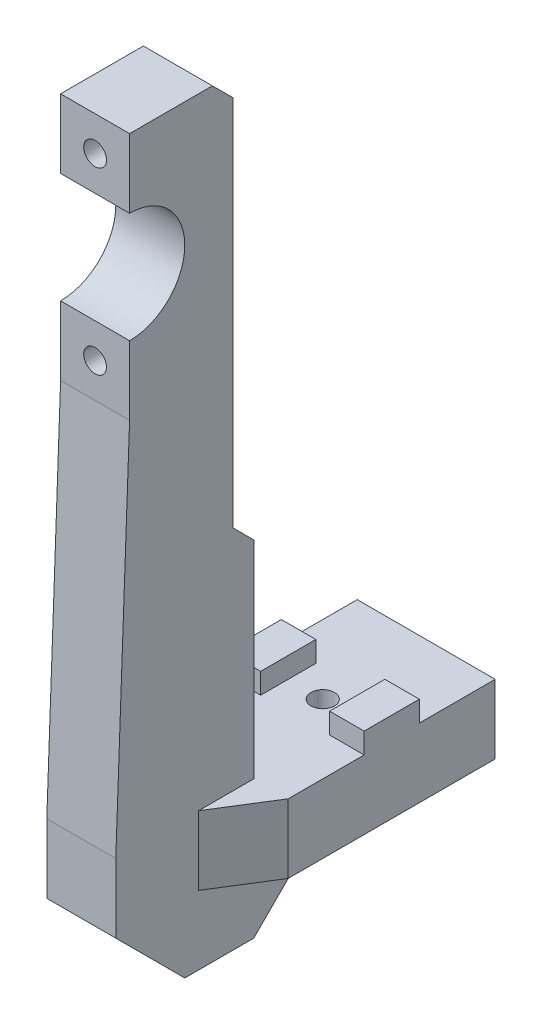
ISO-10303-21;
HEADER;
FILE_DESCRIPTION(('STEP AP214'),'2;1');
FILE_NAME('part.step','',(''),(''),'','','');
FILE_SCHEMA(('AUTOMOTIVE_DESIGN { 1 0 10303 214 1 1 1 1 }'));
ENDSEC;
DATA;
#1=APPLICATION_CONTEXT('core data for automotive mechanical design processes');
#2=APPLICATION_PROTOCOL_DEFINITION('international standard','automotive_design',2000,#1);
#3=PRODUCT_CONTEXT('',#1,'mechanical');
#4=PRODUCT('Part','Part','',(#3));
#5=PRODUCT_RELATED_PRODUCT_CATEGORY('part','',(#4));
#6=PRODUCT_DEFINITION_FORMATION('','',#4);
#7=PRODUCT_DEFINITION_CONTEXT('part definition',#1,'design');
#8=PRODUCT_DEFINITION('design','',#6,#7);
#9=PRODUCT_DEFINITION_SHAPE('','',#8);
#10=(LENGTH_UNIT() NAMED_UNIT(*) SI_UNIT(.MILLI.,.METRE.));
#11=(NAMED_UNIT(*) PLANE_ANGLE_UNIT() SI_UNIT($,.RADIAN.));
#12=(NAMED_UNIT(*) SI_UNIT($,.STERADIAN.) SOLID_ANGLE_UNIT());
#13=UNCERTAINTY_MEASURE_WITH_UNIT(LENGTH_MEASURE(1.E-05),#10,'distance_accuracy_value','');
#14=(GEOMETRIC_REPRESENTATION_CONTEXT(3) GLOBAL_UNCERTAINTY_ASSIGNED_CONTEXT((#13)) GLOBAL_UNIT_ASSIGNED_CONTEXT((#10,
#11,#12)) REPRESENTATION_CONTEXT('',''));
#15=CARTESIAN_POINT('',(0.,0.,0.));
#16=DIRECTION('',(0.,0.,1.));
#17=DIRECTION('',(1.,0.,0.));
#18=AXIS2_PLACEMENT_3D('',#15,#16,#17);
#19=CARTESIAN_POINT('',(0.,0.,0.));
#20=DIRECTION('',(0.,-1.,0.));
#21=DIRECTION('',(0.,0.,-1.));
#22=AXIS2_PLACEMENT_3D('',#19,#20,#21);
#23=PLANE('',#22);
#24=CARTESIAN_POINT('',(10.,0.,-15.));
#25=DIRECTION('',(0.,-1.,0.));
#26=DIRECTION('',(0.,0.,-1.));
#27=AXIS2_PLACEMENT_3D('',#24,#25,#26);
#28=CIRCLE('',#27,1.7);
#29=CARTESIAN_POINT('',(10.,0.,-16.7));
#30=VERTEX_POINT('',#29);
#31=EDGE_CURVE('E247',#30,#30,#28,.T.);
#32=ORIENTED_EDGE('',*,*,#31,.T.);
#33=EDGE_LOOP('',(#32));
#34=FACE_BOUND('',#33,.T.);
#35=DIRECTION('',(-1.,0.,0.));
#36=VECTOR('',#35,1.);
#37=CARTESIAN_POINT('',(20.,0.,-19.));
#38=LINE('',#37,#36);
#39=CARTESIAN_POINT('',(20.,0.,-19.));
#40=VERTEX_POINT('',#39);
#41=CARTESIAN_POINT('',(15.,0.,-19.));
#42=VERTEX_POINT('',#41);
#43=EDGE_CURVE('E256',#40,#42,#38,.T.);
#44=ORIENTED_EDGE('',*,*,#43,.F.);
#45=DIRECTION('',(0.,0.,-1.));
#46=VECTOR('',#45,1.);
#47=CARTESIAN_POINT('',(20.,0.,0.));
#48=LINE('',#47,#46);
#49=CARTESIAN_POINT('',(20.,0.,-30.));
#50=VERTEX_POINT('',#49);
#51=EDGE_CURVE('E440',#40,#50,#48,.T.);
#52=ORIENTED_EDGE('',*,*,#51,.T.);
#53=DIRECTION('',(-1.,0.,0.));
#54=VECTOR('',#53,1.);
#55=CARTESIAN_POINT('',(0.,0.,-30.));
#56=LINE('',#55,#54);
#57=CARTESIAN_POINT('',(0.,0.,-30.));
#58=VERTEX_POINT('',#57);
#59=EDGE_CURVE('E406',#50,#58,#56,.T.);
#60=ORIENTED_EDGE('',*,*,#59,.T.);
#61=DIRECTION('',(0.,0.,1.));
#62=VECTOR('',#61,1.);
#63=CARTESIAN_POINT('',(0.,0.,0.));
#64=LINE('',#63,#62);
#65=CARTESIAN_POINT('',(0.,0.,-19.));
#66=VERTEX_POINT('',#65);
#67=EDGE_CURVE('E423',#58,#66,#64,.T.);
#68=ORIENTED_EDGE('',*,*,#67,.T.);
#69=DIRECTION('',(-1.,0.,0.));
#70=VECTOR('',#69,1.);
#71=CARTESIAN_POINT('',(0.,0.,-19.));
#72=LINE('',#71,#70);
#73=CARTESIAN_POINT('',(5.,0.,-19.));
#74=VERTEX_POINT('',#73);
#75=EDGE_CURVE('E291',#74,#66,#72,.T.);
#76=ORIENTED_EDGE('',*,*,#75,.F.);
#77=DIRECTION('',(0.,0.,-1.));
#78=VECTOR('',#77,1.);
#79=CARTESIAN_POINT('',(5.,0.,-19.));
#80=LINE('',#79,#78);
#81=CARTESIAN_POINT('',(5.,0.,-11.));
#82=VERTEX_POINT('',#81);
#83=EDGE_CURVE('E300',#82,#74,#80,.T.);
#84=ORIENTED_EDGE('',*,*,#83,.F.);
#85=DIRECTION('',(1.,0.,0.));
#86=VECTOR('',#85,1.);
#87=CARTESIAN_POINT('',(0.,0.,-11.));
#88=LINE('',#87,#86);
#89=CARTESIAN_POINT('',(0.,0.,-11.));
#90=VERTEX_POINT('',#89);
#91=EDGE_CURVE('E286',#90,#82,#88,.T.);
#92=ORIENTED_EDGE('',*,*,#91,.F.);
#93=CARTESIAN_POINT('',(0.,0.,0.));
#94=VERTEX_POINT('',#93);
#95=EDGE_CURVE('E401',#90,#94,#64,.T.);
#96=ORIENTED_EDGE('',*,*,#95,.T.);
#97=DIRECTION('',(0.52999894000318,0.,0.847998304005088));
#98=VECTOR('',#97,1.);
#99=CARTESIAN_POINT('',(0.,0.,0.));
#100=LINE('',#99,#98);
#101=CARTESIAN_POINT('',(5.,0.,8.));
#102=VERTEX_POINT('',#101);
#103=EDGE_CURVE('E425',#94,#102,#100,.T.);
#104=ORIENTED_EDGE('',*,*,#103,.T.);
#105=DIRECTION('',(0.,0.,-1.));
#106=VECTOR('',#105,1.);
#107=CARTESIAN_POINT('',(5.,0.,8.));
#108=LINE('',#107,#106);
#109=CARTESIAN_POINT('',(5.,0.,0.));
#110=VERTEX_POINT('',#109);
#111=EDGE_CURVE('E428',#102,#110,#108,.T.);
#112=ORIENTED_EDGE('',*,*,#111,.T.);
#113=DIRECTION('',(1.,0.,0.));
#114=VECTOR('',#113,1.);
#115=CARTESIAN_POINT('',(5.,0.,0.));
#116=LINE('',#115,#114);
#117=CARTESIAN_POINT('',(15.,0.,0.));
#118=VERTEX_POINT('',#117);
#119=EDGE_CURVE('E431',#110,#118,#116,.T.);
#120=ORIENTED_EDGE('',*,*,#119,.T.);
#121=DIRECTION('',(0.,0.,1.));
#122=VECTOR('',#121,1.);
#123=CARTESIAN_POINT('',(15.,0.,8.));
#124=LINE('',#123,#122);
#125=CARTESIAN_POINT('',(15.,0.,8.));
#126=VERTEX_POINT('',#125);
#127=EDGE_CURVE('E434',#118,#126,#124,.T.);
#128=ORIENTED_EDGE('',*,*,#127,.T.);
#129=DIRECTION('',(0.52999894000318,0.,-0.847998304005088));
#130=VECTOR('',#129,1.);
#131=CARTESIAN_POINT('',(20.,0.,0.));
#132=LINE('',#131,#130);
#133=CARTESIAN_POINT('',(20.,0.,0.));
#134=VERTEX_POINT('',#133);
#135=EDGE_CURVE('E437',#126,#134,#132,.T.);
#136=ORIENTED_EDGE('',*,*,#135,.T.);
#137=CARTESIAN_POINT('',(20.,0.,-11.));
#138=VERTEX_POINT('',#137);
#139=EDGE_CURVE('E441',#134,#138,#48,.T.);
#140=ORIENTED_EDGE('',*,*,#139,.T.);
#141=DIRECTION('',(1.,0.,0.));
#142=VECTOR('',#141,1.);
#143=CARTESIAN_POINT('',(20.,0.,-11.));
#144=LINE('',#143,#142);
#145=CARTESIAN_POINT('',(15.,0.,-11.));
#146=VERTEX_POINT('',#145);
#147=EDGE_CURVE('E261',#146,#138,#144,.T.);
#148=ORIENTED_EDGE('',*,*,#147,.F.);
#149=DIRECTION('',(0.,0.,1.));
#150=VECTOR('',#149,1.);
#151=CARTESIAN_POINT('',(15.,0.,-19.));
#152=LINE('',#151,#150);
#153=EDGE_CURVE('E270',#42,#146,#152,.T.);
#154=ORIENTED_EDGE('',*,*,#153,.F.);
#155=EDGE_LOOP('',(#44,#52,#60,#68,#76,#84,#92,#96,#104,#112,#120,#128,#136,#140,#148,#154));
#156=FACE_BOUND('',#155,.T.);
#157=ADVANCED_FACE('F37',(#34,#156),#23,.F.);
#158=CARTESIAN_POINT('',(0.,-10.,0.));
#159=DIRECTION('',(-1.,0.,0.));
#160=DIRECTION('',(0.,0.,1.));
#161=AXIS2_PLACEMENT_3D('',#158,#159,#160);
#162=PLANE('',#161);
#163=ORIENTED_EDGE('',*,*,#67,.F.);
#164=DIRECTION('',(0.,1.,0.));
#165=VECTOR('',#164,1.);
#166=CARTESIAN_POINT('',(0.,-10.,-30.));
#167=LINE('',#166,#165);
#168=CARTESIAN_POINT('',(0.,-10.,-30.));
#169=VERTEX_POINT('',#168);
#170=EDGE_CURVE('E445',#169,#58,#167,.T.);
#171=ORIENTED_EDGE('',*,*,#170,.F.);
#172=DIRECTION('',(0.,0.,1.));
#173=VECTOR('',#172,1.);
#174=CARTESIAN_POINT('',(0.,-10.,0.));
#175=LINE('',#174,#173);
#176=CARTESIAN_POINT('',(0.,-10.,0.));
#177=VERTEX_POINT('',#176);
#178=EDGE_CURVE('E402',#169,#177,#175,.T.);
#179=ORIENTED_EDGE('',*,*,#178,.T.);
#180=DIRECTION('',(0.,1.,0.));
#181=VECTOR('',#180,1.);
#182=CARTESIAN_POINT('',(0.,-10.,0.));
#183=LINE('',#182,#181);
#184=EDGE_CURVE('E422',#177,#94,#183,.T.);
#185=ORIENTED_EDGE('',*,*,#184,.T.);
#186=ORIENTED_EDGE('',*,*,#95,.F.);
#187=DIRECTION('',(0.,-1.,0.));
#188=VECTOR('',#187,1.);
#189=CARTESIAN_POINT('',(0.,3.,-11.));
#190=LINE('',#189,#188);
#191=CARTESIAN_POINT('',(0.,3.,-11.));
#192=VERTEX_POINT('',#191);
#193=EDGE_CURVE('E313',#192,#90,#190,.T.);
#194=ORIENTED_EDGE('',*,*,#193,.F.);
#195=DIRECTION('',(0.,0.,1.));
#196=VECTOR('',#195,1.);
#197=CARTESIAN_POINT('',(0.,3.,-19.));
#198=LINE('',#197,#196);
#199=CARTESIAN_POINT('',(0.,3.,-19.));
#200=VERTEX_POINT('',#199);
#201=EDGE_CURVE('E287',#200,#192,#198,.T.);
#202=ORIENTED_EDGE('',*,*,#201,.F.);
#203=DIRECTION('',(0.,-1.,0.));
#204=VECTOR('',#203,1.);
#205=CARTESIAN_POINT('',(0.,3.,-19.));
#206=LINE('',#205,#204);
#207=EDGE_CURVE('E297',#200,#66,#206,.T.);
#208=ORIENTED_EDGE('',*,*,#207,.T.);
#209=EDGE_LOOP('',(#163,#171,#179,#185,#186,#194,#202,#208));
#210=FACE_BOUND('',#209,.T.);
#211=ADVANCED_FACE('F489',(#210),#162,.T.);
#212=CARTESIAN_POINT('',(0.,-10.,-30.));
#213=DIRECTION('',(0.,0.,-1.));
#214=DIRECTION('',(-1.,0.,0.));
#215=AXIS2_PLACEMENT_3D('',#212,#213,#214);
#216=PLANE('',#215);
#217=ORIENTED_EDGE('',*,*,#59,.F.);
#218=DIRECTION('',(0.,1.,0.));
#219=VECTOR('',#218,1.);
#220=CARTESIAN_POINT('',(20.,-10.,-30.));
#221=LINE('',#220,#219);
#222=CARTESIAN_POINT('',(20.,-10.,-30.));
#223=VERTEX_POINT('',#222);
#224=EDGE_CURVE('E448',#223,#50,#221,.T.);
#225=ORIENTED_EDGE('',*,*,#224,.F.);
#226=DIRECTION('',(-1.,0.,0.));
#227=VECTOR('',#226,1.);
#228=CARTESIAN_POINT('',(0.,-10.,-30.));
#229=LINE('',#228,#227);
#230=EDGE_CURVE('E419',#223,#169,#229,.T.);
#231=ORIENTED_EDGE('',*,*,#230,.T.);
#232=ORIENTED_EDGE('',*,*,#170,.T.);
#233=EDGE_LOOP('',(#217,#225,#231,#232));
#234=FACE_BOUND('',#233,.T.);
#235=ADVANCED_FACE('F495',(#234),#216,.T.);
#236=CARTESIAN_POINT('',(20.,-10.,0.));
#237=DIRECTION('',(1.,0.,0.));
#238=DIRECTION('',(0.,0.,-1.));
#239=AXIS2_PLACEMENT_3D('',#236,#237,#238);
#240=PLANE('',#239);
#241=ORIENTED_EDGE('',*,*,#139,.F.);
#242=DIRECTION('',(0.,1.,0.));
#243=VECTOR('',#242,1.);
#244=CARTESIAN_POINT('',(20.,-10.,0.));
#245=LINE('',#244,#243);
#246=CARTESIAN_POINT('',(20.,-10.,0.));
#247=VERTEX_POINT('',#246);
#248=EDGE_CURVE('E451',#247,#134,#245,.T.);
#249=ORIENTED_EDGE('',*,*,#248,.F.);
#250=DIRECTION('',(0.,0.,-1.));
#251=VECTOR('',#250,1.);
#252=CARTESIAN_POINT('',(20.,-10.,0.));
#253=LINE('',#252,#251);
#254=EDGE_CURVE('E416',#247,#223,#253,.T.);
#255=ORIENTED_EDGE('',*,*,#254,.T.);
#256=ORIENTED_EDGE('',*,*,#224,.T.);
#257=ORIENTED_EDGE('',*,*,#51,.F.);
#258=DIRECTION('',(0.,-1.,0.));
#259=VECTOR('',#258,1.);
#260=CARTESIAN_POINT('',(20.,3.,-19.));
#261=LINE('',#260,#259);
#262=CARTESIAN_POINT('',(20.,3.,-19.));
#263=VERTEX_POINT('',#262);
#264=EDGE_CURVE('E283',#263,#40,#261,.T.);
#265=ORIENTED_EDGE('',*,*,#264,.F.);
#266=DIRECTION('',(0.,0.,-1.));
#267=VECTOR('',#266,1.);
#268=CARTESIAN_POINT('',(20.,3.,-19.));
#269=LINE('',#268,#267);
#270=CARTESIAN_POINT('',(20.,3.,-11.));
#271=VERTEX_POINT('',#270);
#272=EDGE_CURVE('E257',#271,#263,#269,.T.);
#273=ORIENTED_EDGE('',*,*,#272,.F.);
#274=DIRECTION('',(0.,-1.,0.));
#275=VECTOR('',#274,1.);
#276=CARTESIAN_POINT('',(20.,3.,-11.));
#277=LINE('',#276,#275);
#278=EDGE_CURVE('E267',#271,#138,#277,.T.);
#279=ORIENTED_EDGE('',*,*,#278,.T.);
#280=EDGE_LOOP('',(#241,#249,#255,#256,#257,#265,#273,#279));
#281=FACE_BOUND('',#280,.T.);
#282=ADVANCED_FACE('F504',(#281),#240,.T.);
#283=CARTESIAN_POINT('',(20.,-10.,0.));
#284=DIRECTION('',(0.847998304005088,0.,0.52999894000318));
#285=DIRECTION('',(0.52999894000318,0.,-0.847998304005088));
#286=AXIS2_PLACEMENT_3D('',#283,#284,#285);
#287=PLANE('',#286);
#288=ORIENTED_EDGE('',*,*,#135,.F.);
#289=DIRECTION('',(0.,1.,0.));
#290=VECTOR('',#289,1.);
#291=CARTESIAN_POINT('',(15.,-10.,8.));
#292=LINE('',#291,#290);
#293=CARTESIAN_POINT('',(15.,-10.,8.));
#294=VERTEX_POINT('',#293);
#295=EDGE_CURVE('E453',#294,#126,#292,.T.);
#296=ORIENTED_EDGE('',*,*,#295,.F.);
#297=DIRECTION('',(0.52999894000318,0.,-0.847998304005088));
#298=VECTOR('',#297,1.);
#299=CARTESIAN_POINT('',(20.,-10.,0.));
#300=LINE('',#299,#298);
#301=EDGE_CURVE('E413',#294,#247,#300,.T.);
#302=ORIENTED_EDGE('',*,*,#301,.T.);
#303=ORIENTED_EDGE('',*,*,#248,.T.);
#304=EDGE_LOOP('',(#288,#296,#302,#303));
#305=FACE_BOUND('',#304,.T.);
#306=ADVANCED_FACE('F508',(#305),#287,.T.);
#307=CARTESIAN_POINT('',(0.,-10.,0.));
#308=DIRECTION('',(-0.847998304005088,0.,0.52999894000318));
#309=DIRECTION('',(0.52999894000318,0.,0.847998304005088));
#310=AXIS2_PLACEMENT_3D('',#307,#308,#309);
#311=PLANE('',#310);
#312=ORIENTED_EDGE('',*,*,#103,.F.);
#313=ORIENTED_EDGE('',*,*,#184,.F.);
#314=DIRECTION('',(0.52999894000318,0.,0.847998304005088));
#315=VECTOR('',#314,1.);
#316=CARTESIAN_POINT('',(0.,-10.,0.));
#317=LINE('',#316,#315);
#318=CARTESIAN_POINT('',(5.,-10.,8.));
#319=VERTEX_POINT('',#318);
#320=EDGE_CURVE('E405',#177,#319,#317,.T.);
#321=ORIENTED_EDGE('',*,*,#320,.T.);
#322=DIRECTION('',(0.,1.,0.));
#323=VECTOR('',#322,1.);
#324=CARTESIAN_POINT('',(5.,-10.,8.));
#325=LINE('',#324,#323);
#326=EDGE_CURVE('E455',#319,#102,#325,.T.);
#327=ORIENTED_EDGE('',*,*,#326,.T.);
#328=EDGE_LOOP('',(#312,#313,#321,#327));
#329=FACE_BOUND('',#328,.T.);
#330=ADVANCED_FACE('F512',(#329),#311,.T.);
#331=CARTESIAN_POINT('',(0.,-10.,0.));
#332=DIRECTION('',(0.,-1.,0.));
#333=DIRECTION('',(0.,0.,-1.));
#334=AXIS2_PLACEMENT_3D('',#331,#332,#333);
#335=PLANE('',#334);
#336=CARTESIAN_POINT('',(10.,-10.,-15.));
#337=DIRECTION('',(0.,-1.,0.));
#338=DIRECTION('',(0.,0.,-1.));
#339=AXIS2_PLACEMENT_3D('',#336,#337,#338);
#340=CIRCLE('',#339,3.15);
#341=CARTESIAN_POINT('',(10.,-10.,-18.15));
#342=VERTEX_POINT('',#341);
#343=EDGE_CURVE('E253',#342,#342,#340,.T.);
#344=ORIENTED_EDGE('',*,*,#343,.F.);
#345=EDGE_LOOP('',(#344));
#346=FACE_BOUND('',#345,.T.);
#347=DIRECTION('',(0.,0.,1.));
#348=VECTOR('',#347,1.);
#349=CARTESIAN_POINT('',(15.,-10.,8.));
#350=LINE('',#349,#348);
#351=CARTESIAN_POINT('',(15.,-10.,-10.));
#352=VERTEX_POINT('',#351);
#353=EDGE_CURVE('E411',#352,#294,#350,.T.);
#354=ORIENTED_EDGE('',*,*,#353,.F.);
#355=DIRECTION('',(-1.,0.,0.));
#356=VECTOR('',#355,1.);
#357=CARTESIAN_POINT('',(15.,-10.,-10.));
#358=LINE('',#357,#356);
#359=CARTESIAN_POINT('',(5.,-10.,-10.));
#360=VERTEX_POINT('',#359);
#361=EDGE_CURVE('E392',#352,#360,#358,.T.);
#362=ORIENTED_EDGE('',*,*,#361,.T.);
#363=DIRECTION('',(0.,0.,-1.));
#364=VECTOR('',#363,1.);
#365=CARTESIAN_POINT('',(5.,-10.,8.));
#366=LINE('',#365,#364);
#367=EDGE_CURVE('E409',#319,#360,#366,.T.);
#368=ORIENTED_EDGE('',*,*,#367,.F.);
#369=ORIENTED_EDGE('',*,*,#320,.F.);
#370=ORIENTED_EDGE('',*,*,#178,.F.);
#371=ORIENTED_EDGE('',*,*,#230,.F.);
#372=ORIENTED_EDGE('',*,*,#254,.F.);
#373=ORIENTED_EDGE('',*,*,#301,.F.);
#374=EDGE_LOOP('',(#354,#362,#368,#369,#370,#371,#372,#373));
#375=FACE_BOUND('',#374,.T.);
#376=ADVANCED_FACE('F500',(#346,#375),#335,.T.);
#377=CARTESIAN_POINT('',(15.,30.,0.));
#378=DIRECTION('',(0.,0.,1.));
#379=DIRECTION('',(0.,-1.,0.));
#380=AXIS2_PLACEMENT_3D('',#377,#378,#379);
#381=PLANE('',#380);
#382=DIRECTION('',(0.,1.,0.));
#383=VECTOR('',#382,1.);
#384=CARTESIAN_POINT('',(15.,30.,0.));
#385=LINE('',#384,#383);
#386=CARTESIAN_POINT('',(15.,30.,0.));
#387=VERTEX_POINT('',#386);
#388=EDGE_CURVE('E326',#118,#387,#385,.T.);
#389=ORIENTED_EDGE('',*,*,#388,.F.);
#390=ORIENTED_EDGE('',*,*,#119,.F.);
#391=DIRECTION('',(0.,1.,0.));
#392=VECTOR('',#391,1.);
#393=CARTESIAN_POINT('',(5.,30.,0.));
#394=LINE('',#393,#392);
#395=CARTESIAN_POINT('',(5.,30.,0.));
#396=VERTEX_POINT('',#395);
#397=EDGE_CURVE('E352',#110,#396,#394,.T.);
#398=ORIENTED_EDGE('',*,*,#397,.T.);
#399=DIRECTION('',(-1.,0.,0.));
#400=VECTOR('',#399,1.);
#401=CARTESIAN_POINT('',(15.,30.,0.));
#402=LINE('',#401,#400);
#403=EDGE_CURVE('E389',#387,#396,#402,.T.);
#404=ORIENTED_EDGE('',*,*,#403,.F.);
#405=EDGE_LOOP('',(#389,#390,#398,#404));
#406=FACE_BOUND('',#405,.T.);
#407=ADVANCED_FACE('F519',(#406),#381,.F.);
#408=CARTESIAN_POINT('',(15.,-9.99999999999999,20.));
#409=DIRECTION('',(0.,0.707106781186548,-0.707106781186547));
#410=DIRECTION('',(0.,0.707106781186547,0.707106781186548));
#411=AXIS2_PLACEMENT_3D('',#408,#409,#410);
#412=PLANE('',#411);
#413=DIRECTION('',(0.,-0.707106781186547,-0.707106781186548));
#414=VECTOR('',#413,1.);
#415=CARTESIAN_POINT('',(5.,-9.99999999999999,20.));
#416=LINE('',#415,#414);
#417=CARTESIAN_POINT('',(5.,-9.99999999999999,20.));
#418=VERTEX_POINT('',#417);
#419=CARTESIAN_POINT('',(5.,-20.,9.99999999999999));
#420=VERTEX_POINT('',#419);
#421=EDGE_CURVE('E316',#418,#420,#416,.T.);
#422=ORIENTED_EDGE('',*,*,#421,.T.);
#423=DIRECTION('',(-1.,0.,0.));
#424=VECTOR('',#423,1.);
#425=CARTESIAN_POINT('',(15.,-20.,9.99999999999999));
#426=LINE('',#425,#424);
#427=CARTESIAN_POINT('',(15.,-20.,9.99999999999999));
#428=VERTEX_POINT('',#427);
#429=EDGE_CURVE('E398',#428,#420,#426,.T.);
#430=ORIENTED_EDGE('',*,*,#429,.F.);
#431=DIRECTION('',(0.,-0.707106781186547,-0.707106781186548));
#432=VECTOR('',#431,1.);
#433=CARTESIAN_POINT('',(15.,-9.99999999999999,20.));
#434=LINE('',#433,#432);
#435=CARTESIAN_POINT('',(15.,-9.99999999999999,20.));
#436=VERTEX_POINT('',#435);
#437=EDGE_CURVE('E317',#436,#428,#434,.T.);
#438=ORIENTED_EDGE('',*,*,#437,.F.);
#439=DIRECTION('',(-1.,0.,0.));
#440=VECTOR('',#439,1.);
#441=CARTESIAN_POINT('',(15.,-9.99999999999999,20.));
#442=LINE('',#441,#440);
#443=EDGE_CURVE('E344',#436,#418,#442,.T.);
#444=ORIENTED_EDGE('',*,*,#443,.T.);
#445=EDGE_LOOP('',(#422,#430,#438,#444));
#446=FACE_BOUND('',#445,.T.);
#447=ADVANCED_FACE('F620',(#446),#412,.F.);
#448=CARTESIAN_POINT('',(15.,-20.,9.99999999999999));
#449=DIRECTION('',(0.,1.,0.));
#450=DIRECTION('',(0.,0.,1.));
#451=AXIS2_PLACEMENT_3D('',#448,#449,#450);
#452=PLANE('',#451);
#453=DIRECTION('',(0.,0.,-1.));
#454=VECTOR('',#453,1.);
#455=CARTESIAN_POINT('',(5.,-20.,9.99999999999999));
#456=LINE('',#455,#454);
#457=CARTESIAN_POINT('',(5.,-20.,0.));
#458=VERTEX_POINT('',#457);
#459=EDGE_CURVE('E347',#420,#458,#456,.T.);
#460=ORIENTED_EDGE('',*,*,#459,.T.);
#461=DIRECTION('',(-1.,0.,0.));
#462=VECTOR('',#461,1.);
#463=CARTESIAN_POINT('',(15.,-20.,0.));
#464=LINE('',#463,#462);
#465=CARTESIAN_POINT('',(15.,-20.,0.));
#466=VERTEX_POINT('',#465);
#467=EDGE_CURVE('E395',#466,#458,#464,.T.);
#468=ORIENTED_EDGE('',*,*,#467,.F.);
#469=DIRECTION('',(0.,0.,-1.));
#470=VECTOR('',#469,1.);
#471=CARTESIAN_POINT('',(15.,-20.,9.99999999999999));
#472=LINE('',#471,#470);
#473=EDGE_CURVE('E320',#428,#466,#472,.T.);
#474=ORIENTED_EDGE('',*,*,#473,.F.);
#475=ORIENTED_EDGE('',*,*,#429,.T.);
#476=EDGE_LOOP('',(#460,#468,#474,#475));
#477=FACE_BOUND('',#476,.T.);
#478=ADVANCED_FACE('F623',(#477),#452,.F.);
#479=CARTESIAN_POINT('',(15.,-10.,-10.));
#480=DIRECTION('',(0.,0.707106781186547,0.707106781186548));
#481=DIRECTION('',(0.,-0.707106781186548,0.707106781186547));
#482=AXIS2_PLACEMENT_3D('',#479,#480,#481);
#483=PLANE('',#482);
#484=DIRECTION('',(0.,0.707106781186548,-0.707106781186547));
#485=VECTOR('',#484,1.);
#486=CARTESIAN_POINT('',(5.,-10.,-10.));
#487=LINE('',#486,#485);
#488=EDGE_CURVE('E349',#458,#360,#487,.T.);
#489=ORIENTED_EDGE('',*,*,#488,.T.);
#490=ORIENTED_EDGE('',*,*,#361,.F.);
#491=DIRECTION('',(0.,0.707106781186548,-0.707106781186547));
#492=VECTOR('',#491,1.);
#493=CARTESIAN_POINT('',(15.,-10.,-10.));
#494=LINE('',#493,#492);
#495=EDGE_CURVE('E323',#466,#352,#494,.T.);
#496=ORIENTED_EDGE('',*,*,#495,.F.);
#497=ORIENTED_EDGE('',*,*,#467,.T.);
#498=EDGE_LOOP('',(#489,#490,#496,#497));
#499=FACE_BOUND('',#498,.T.);
#500=ADVANCED_FACE('F541',(#499),#483,.F.);
#501=CARTESIAN_POINT('',(15.,30.,0.));
#502=DIRECTION('',(0.,-0.707106781186547,0.707106781186548));
#503=DIRECTION('',(0.,-0.707106781186548,-0.707106781186547));
#504=AXIS2_PLACEMENT_3D('',#501,#502,#503);
#505=PLANE('',#504);
#506=DIRECTION('',(0.,0.707106781186548,0.707106781186547));
#507=VECTOR('',#506,1.);
#508=CARTESIAN_POINT('',(5.,30.,0.));
#509=LINE('',#508,#507);
#510=CARTESIAN_POINT('',(5.,33.,2.99999999999999));
#511=VERTEX_POINT('',#510);
#512=EDGE_CURVE('E354',#396,#511,#509,.T.);
#513=ORIENTED_EDGE('',*,*,#512,.T.);
#514=DIRECTION('',(-1.,0.,0.));
#515=VECTOR('',#514,1.);
#516=CARTESIAN_POINT('',(15.,33.,2.99999999999999));
#517=LINE('',#516,#515);
#518=CARTESIAN_POINT('',(15.,33.,2.99999999999999));
#519=VERTEX_POINT('',#518);
#520=EDGE_CURVE('E386',#519,#511,#517,.T.);
#521=ORIENTED_EDGE('',*,*,#520,.F.);
#522=DIRECTION('',(0.,0.707106781186548,0.707106781186547));
#523=VECTOR('',#522,1.);
#524=CARTESIAN_POINT('',(15.,30.,0.));
#525=LINE('',#524,#523);
#526=EDGE_CURVE('E328',#387,#519,#525,.T.);
#527=ORIENTED_EDGE('',*,*,#526,.F.);
#528=ORIENTED_EDGE('',*,*,#403,.T.);
#529=EDGE_LOOP('',(#513,#521,#527,#528));
#530=FACE_BOUND('',#529,.T.);
#531=ADVANCED_FACE('F614',(#530),#505,.F.);
#532=CARTESIAN_POINT('',(15.,33.,2.99999999999999));
#533=DIRECTION('',(0.,0.,1.));
#534=DIRECTION('',(0.,-1.,0.));
#535=AXIS2_PLACEMENT_3D('',#532,#533,#534);
#536=PLANE('',#535);
#537=DIRECTION('',(0.,1.,0.));
#538=VECTOR('',#537,1.);
#539=CARTESIAN_POINT('',(5.,33.,2.99999999999999));
#540=LINE('',#539,#538);
#541=CARTESIAN_POINT('',(5.,87.,2.99999999999999));
#542=VERTEX_POINT('',#541);
#543=EDGE_CURVE('E356',#511,#542,#540,.T.);
#544=ORIENTED_EDGE('',*,*,#543,.T.);
#545=DIRECTION('',(1.,0.,0.));
#546=VECTOR('',#545,1.);
#547=CARTESIAN_POINT('',(15.,87.,2.99999999999999));
#548=LINE('',#547,#546);
#549=CARTESIAN_POINT('',(15.,87.,2.99999999999999));
#550=VERTEX_POINT('',#549);
#551=EDGE_CURVE('E46',#542,#550,#548,.T.);
#552=ORIENTED_EDGE('',*,*,#551,.T.);
#553=DIRECTION('',(0.,1.,0.));
#554=VECTOR('',#553,1.);
#555=CARTESIAN_POINT('',(15.,33.,2.99999999999999));
#556=LINE('',#555,#554);
#557=EDGE_CURVE('E330',#519,#550,#556,.T.);
#558=ORIENTED_EDGE('',*,*,#557,.F.);
#559=ORIENTED_EDGE('',*,*,#520,.T.);
#560=EDGE_LOOP('',(#544,#552,#558,#559));
#561=FACE_BOUND('',#560,.T.);
#562=ADVANCED_FACE('F611',(#561),#536,.F.);
#563=CARTESIAN_POINT('',(15.,90.,2.99999999999999));
#564=DIRECTION('',(0.,-1.,0.));
#565=DIRECTION('',(0.,0.,-1.));
#566=AXIS2_PLACEMENT_3D('',#563,#564,#565);
#567=PLANE('',#566);
#568=DIRECTION('',(0.,0.,1.));
#569=VECTOR('',#568,1.);
#570=CARTESIAN_POINT('',(15.,90.,2.99999999999999));
#571=LINE('',#570,#569);
#572=CARTESIAN_POINT('',(15.,90.,6.));
#573=VERTEX_POINT('',#572);
#574=CARTESIAN_POINT('',(15.,90.,18.));
#575=VERTEX_POINT('',#574);
#576=EDGE_CURVE('E332',#573,#575,#571,.T.);
#577=ORIENTED_EDGE('',*,*,#576,.F.);
#578=DIRECTION('',(-1.,0.,0.));
#579=VECTOR('',#578,1.);
#580=CARTESIAN_POINT('',(15.,90.,6.));
#581=LINE('',#580,#579);
#582=CARTESIAN_POINT('',(5.,90.,6.));
#583=VERTEX_POINT('',#582);
#584=EDGE_CURVE('E447',#573,#583,#581,.T.);
#585=ORIENTED_EDGE('',*,*,#584,.T.);
#586=DIRECTION('',(0.,0.,1.));
#587=VECTOR('',#586,1.);
#588=CARTESIAN_POINT('',(5.,90.,2.99999999999999));
#589=LINE('',#588,#587);
#590=CARTESIAN_POINT('',(5.,90.,18.));
#591=VERTEX_POINT('',#590);
#592=EDGE_CURVE('E358',#583,#591,#589,.T.);
#593=ORIENTED_EDGE('',*,*,#592,.T.);
#594=DIRECTION('',(-1.,0.,0.));
#595=VECTOR('',#594,1.);
#596=CARTESIAN_POINT('',(15.,90.,18.));
#597=LINE('',#596,#595);
#598=EDGE_CURVE('E383',#575,#591,#597,.T.);
#599=ORIENTED_EDGE('',*,*,#598,.F.);
#600=EDGE_LOOP('',(#577,#585,#593,#599));
#601=FACE_BOUND('',#600,.T.);
#602=ADVANCED_FACE('F465',(#601),#567,.F.);
#603=CARTESIAN_POINT('',(15.,90.,18.));
#604=DIRECTION('',(0.,0.,-1.));
#605=DIRECTION('',(-1.,0.,0.));
#606=AXIS2_PLACEMENT_3D('',#603,#604,#605);
#607=PLANE('',#606);
#608=CARTESIAN_POINT('',(10.,85.,18.));
#609=DIRECTION('',(0.,0.,1.));
#610=DIRECTION('',(0.,-1.,0.));
#611=AXIS2_PLACEMENT_3D('',#608,#609,#610);
#612=CIRCLE('',#611,1.65);
#613=CARTESIAN_POINT('',(10.,83.35,18.));
#614=VERTEX_POINT('',#613);
#615=EDGE_CURVE('E236',#614,#614,#612,.T.);
#616=ORIENTED_EDGE('',*,*,#615,.F.);
#617=EDGE_LOOP('',(#616));
#618=FACE_BOUND('',#617,.T.);
#619=DIRECTION('',(0.,-1.,0.));
#620=VECTOR('',#619,1.);
#621=CARTESIAN_POINT('',(5.,90.,18.));
#622=LINE('',#621,#620);
#623=CARTESIAN_POINT('',(5.,80.,18.));
#624=VERTEX_POINT('',#623);
#625=EDGE_CURVE('E360',#591,#624,#622,.T.);
#626=ORIENTED_EDGE('',*,*,#625,.T.);
#627=DIRECTION('',(-1.,0.,0.));
#628=VECTOR('',#627,1.);
#629=CARTESIAN_POINT('',(15.,80.,18.));
#630=LINE('',#629,#628);
#631=CARTESIAN_POINT('',(15.,80.,18.));
#632=VERTEX_POINT('',#631);
#633=EDGE_CURVE('E380',#632,#624,#630,.T.);
#634=ORIENTED_EDGE('',*,*,#633,.F.);
#635=DIRECTION('',(0.,-1.,0.));
#636=VECTOR('',#635,1.);
#637=CARTESIAN_POINT('',(15.,90.,18.));
#638=LINE('',#637,#636);
#639=EDGE_CURVE('E334',#575,#632,#638,.T.);
#640=ORIENTED_EDGE('',*,*,#639,.F.);
#641=ORIENTED_EDGE('',*,*,#598,.T.);
#642=EDGE_LOOP('',(#626,#634,#640,#641));
#643=FACE_BOUND('',#642,.T.);
#644=ADVANCED_FACE('F475',(#618,#643),#607,.F.);
#645=CARTESIAN_POINT('',(15.,72.,18.));
#646=DIRECTION('',(-1.,0.,0.));
#647=DIRECTION('',(0.,0.,1.));
#648=AXIS2_PLACEMENT_3D('',#645,#646,#647);
#649=CYLINDRICAL_SURFACE('',#648,8.00000000000001);
#650=CARTESIAN_POINT('',(5.,72.,18.));
#651=DIRECTION('',(-1.,0.,0.));
#652=DIRECTION('',(0.,0.,-1.));
#653=AXIS2_PLACEMENT_3D('',#650,#651,#652);
#654=CIRCLE('',#653,8.00000000000001);
#655=CARTESIAN_POINT('',(5.,64.,18.));
#656=VERTEX_POINT('',#655);
#657=EDGE_CURVE('E362',#624,#656,#654,.T.);
#658=ORIENTED_EDGE('',*,*,#657,.T.);
#659=DIRECTION('',(-1.,0.,0.));
#660=VECTOR('',#659,1.);
#661=CARTESIAN_POINT('',(15.,64.,18.));
#662=LINE('',#661,#660);
#663=CARTESIAN_POINT('',(15.,64.,18.));
#664=VERTEX_POINT('',#663);
#665=EDGE_CURVE('E377',#664,#656,#662,.T.);
#666=ORIENTED_EDGE('',*,*,#665,.F.);
#667=CARTESIAN_POINT('',(15.,72.,18.));
#668=DIRECTION('',(-1.,0.,0.));
#669=DIRECTION('',(0.,0.,-1.));
#670=AXIS2_PLACEMENT_3D('',#667,#668,#669);
#671=CIRCLE('',#670,8.00000000000001);
#672=EDGE_CURVE('E336',#632,#664,#671,.T.);
#673=ORIENTED_EDGE('',*,*,#672,.F.);
#674=ORIENTED_EDGE('',*,*,#633,.T.);
#675=EDGE_LOOP('',(#658,#666,#673,#674));
#676=FACE_BOUND('',#675,.T.);
#677=ADVANCED_FACE('F479',(#676),#649,.F.);
#678=CARTESIAN_POINT('',(15.,64.,18.));
#679=DIRECTION('',(0.,0.,-1.));
#680=DIRECTION('',(0.,1.,0.));
#681=AXIS2_PLACEMENT_3D('',#678,#679,#680);
#682=PLANE('',#681);
#683=CARTESIAN_POINT('',(10.,59.,18.));
#684=DIRECTION('',(0.,0.,1.));
#685=DIRECTION('',(0.,-1.,0.));
#686=AXIS2_PLACEMENT_3D('',#683,#684,#685);
#687=CIRCLE('',#686,1.65);
#688=CARTESIAN_POINT('',(10.,57.35,18.));
#689=VERTEX_POINT('',#688);
#690=EDGE_CURVE('E244',#689,#689,#687,.T.);
#691=ORIENTED_EDGE('',*,*,#690,.F.);
#692=EDGE_LOOP('',(#691));
#693=FACE_BOUND('',#692,.T.);
#694=DIRECTION('',(0.,-1.,0.));
#695=VECTOR('',#694,1.);
#696=CARTESIAN_POINT('',(5.,64.,18.));
#697=LINE('',#696,#695);
#698=CARTESIAN_POINT('',(5.,54.,18.));
#699=VERTEX_POINT('',#698);
#700=EDGE_CURVE('E364',#656,#699,#697,.T.);
#701=ORIENTED_EDGE('',*,*,#700,.T.);
#702=DIRECTION('',(-1.,0.,0.));
#703=VECTOR('',#702,1.);
#704=CARTESIAN_POINT('',(15.,54.,18.));
#705=LINE('',#704,#703);
#706=CARTESIAN_POINT('',(15.,54.,18.));
#707=VERTEX_POINT('',#706);
#708=EDGE_CURVE('E374',#707,#699,#705,.T.);
#709=ORIENTED_EDGE('',*,*,#708,.F.);
#710=DIRECTION('',(0.,-1.,0.));
#711=VECTOR('',#710,1.);
#712=CARTESIAN_POINT('',(15.,64.,18.));
#713=LINE('',#712,#711);
#714=EDGE_CURVE('E338',#664,#707,#713,.T.);
#715=ORIENTED_EDGE('',*,*,#714,.F.);
#716=ORIENTED_EDGE('',*,*,#665,.T.);
#717=EDGE_LOOP('',(#701,#709,#715,#716));
#718=FACE_BOUND('',#717,.T.);
#719=ADVANCED_FACE('F599',(#693,#718),#682,.F.);
#720=CARTESIAN_POINT('',(15.,54.,18.));
#721=DIRECTION('',(0.,-0.0370116605098801,-0.999314833766767));
#722=DIRECTION('',(0.,0.999314833766767,-0.0370116605098801));
#723=AXIS2_PLACEMENT_3D('',#720,#721,#722);
#724=PLANE('',#723);
#725=DIRECTION('',(0.,-0.999314833766767,0.0370116605098801));
#726=VECTOR('',#725,1.);
#727=CARTESIAN_POINT('',(5.,54.,18.));
#728=LINE('',#727,#726);
#729=CARTESIAN_POINT('',(5.,0.,20.));
#730=VERTEX_POINT('',#729);
#731=EDGE_CURVE('E366',#699,#730,#728,.T.);
#732=ORIENTED_EDGE('',*,*,#731,.T.);
#733=DIRECTION('',(-1.,0.,0.));
#734=VECTOR('',#733,1.);
#735=CARTESIAN_POINT('',(15.,0.,20.));
#736=LINE('',#735,#734);
#737=CARTESIAN_POINT('',(15.,0.,20.));
#738=VERTEX_POINT('',#737);
#739=EDGE_CURVE('E371',#738,#730,#736,.T.);
#740=ORIENTED_EDGE('',*,*,#739,.F.);
#741=DIRECTION('',(0.,-0.999314833766767,0.0370116605098801));
#742=VECTOR('',#741,1.);
#743=CARTESIAN_POINT('',(15.,54.,18.));
#744=LINE('',#743,#742);
#745=EDGE_CURVE('E340',#707,#738,#744,.T.);
#746=ORIENTED_EDGE('',*,*,#745,.F.);
#747=ORIENTED_EDGE('',*,*,#708,.T.);
#748=EDGE_LOOP('',(#732,#740,#746,#747));
#749=FACE_BOUND('',#748,.T.);
#750=ADVANCED_FACE('F595',(#749),#724,.F.);
#751=CARTESIAN_POINT('',(15.,0.,20.));
#752=DIRECTION('',(0.,0.,-1.));
#753=DIRECTION('',(-1.,0.,0.));
#754=AXIS2_PLACEMENT_3D('',#751,#752,#753);
#755=PLANE('',#754);
#756=DIRECTION('',(0.,-1.,0.));
#757=VECTOR('',#756,1.);
#758=CARTESIAN_POINT('',(5.,0.,20.));
#759=LINE('',#758,#757);
#760=EDGE_CURVE('E321',#730,#418,#759,.T.);
#761=ORIENTED_EDGE('',*,*,#760,.T.);
#762=ORIENTED_EDGE('',*,*,#443,.F.);
#763=DIRECTION('',(0.,-1.,0.));
#764=VECTOR('',#763,1.);
#765=CARTESIAN_POINT('',(15.,0.,20.));
#766=LINE('',#765,#764);
#767=EDGE_CURVE('E342',#738,#436,#766,.T.);
#768=ORIENTED_EDGE('',*,*,#767,.F.);
#769=ORIENTED_EDGE('',*,*,#739,.T.);
#770=EDGE_LOOP('',(#761,#762,#768,#769));
#771=FACE_BOUND('',#770,.T.);
#772=ADVANCED_FACE('F590',(#771),#755,.F.);
#773=CARTESIAN_POINT('',(15.,72.,18.));
#774=DIRECTION('',(1.,0.,0.));
#775=DIRECTION('',(0.,0.,-1.));
#776=AXIS2_PLACEMENT_3D('',#773,#774,#775);
#777=PLANE('',#776);
#778=ORIENTED_EDGE('',*,*,#557,.T.);
#779=DIRECTION('',(0.,-0.707106781186549,-0.707106781186546));
#780=VECTOR('',#779,1.);
#781=CARTESIAN_POINT('',(15.,87.,2.99999999999999));
#782=LINE('',#781,#780);
#783=EDGE_CURVE('E11',#550,#573,#782,.F.);
#784=ORIENTED_EDGE('',*,*,#783,.T.);
#785=ORIENTED_EDGE('',*,*,#576,.T.);
#786=ORIENTED_EDGE('',*,*,#639,.T.);
#787=ORIENTED_EDGE('',*,*,#672,.T.);
#788=ORIENTED_EDGE('',*,*,#714,.T.);
#789=ORIENTED_EDGE('',*,*,#745,.T.);
#790=ORIENTED_EDGE('',*,*,#767,.T.);
#791=ORIENTED_EDGE('',*,*,#437,.T.);
#792=ORIENTED_EDGE('',*,*,#473,.T.);
#793=ORIENTED_EDGE('',*,*,#495,.T.);
#794=ORIENTED_EDGE('',*,*,#353,.T.);
#795=ORIENTED_EDGE('',*,*,#295,.T.);
#796=ORIENTED_EDGE('',*,*,#127,.F.);
#797=ORIENTED_EDGE('',*,*,#388,.T.);
#798=ORIENTED_EDGE('',*,*,#526,.T.);
#799=EDGE_LOOP('',(#778,#784,#785,#786,#787,#788,#789,#790,#791,#792,#793,#794,#795,#796,#797,#798));
#800=FACE_BOUND('',#799,.T.);
#801=ADVANCED_FACE('F483',(#800),#777,.T.);
#802=CARTESIAN_POINT('',(5.,72.,18.));
#803=DIRECTION('',(1.,0.,0.));
#804=DIRECTION('',(0.,0.,-1.));
#805=AXIS2_PLACEMENT_3D('',#802,#803,#804);
#806=PLANE('',#805);
#807=ORIENTED_EDGE('',*,*,#592,.F.);
#808=DIRECTION('',(0.,0.707106781186549,0.707106781186546));
#809=VECTOR('',#808,1.);
#810=CARTESIAN_POINT('',(5.,90.,6.));
#811=LINE('',#810,#809);
#812=EDGE_CURVE('E60',#583,#542,#811,.F.);
#813=ORIENTED_EDGE('',*,*,#812,.T.);
#814=ORIENTED_EDGE('',*,*,#543,.F.);
#815=ORIENTED_EDGE('',*,*,#512,.F.);
#816=ORIENTED_EDGE('',*,*,#397,.F.);
#817=ORIENTED_EDGE('',*,*,#111,.F.);
#818=ORIENTED_EDGE('',*,*,#326,.F.);
#819=ORIENTED_EDGE('',*,*,#367,.T.);
#820=ORIENTED_EDGE('',*,*,#488,.F.);
#821=ORIENTED_EDGE('',*,*,#459,.F.);
#822=ORIENTED_EDGE('',*,*,#421,.F.);
#823=ORIENTED_EDGE('',*,*,#760,.F.);
#824=ORIENTED_EDGE('',*,*,#731,.F.);
#825=ORIENTED_EDGE('',*,*,#700,.F.);
#826=ORIENTED_EDGE('',*,*,#657,.F.);
#827=ORIENTED_EDGE('',*,*,#625,.F.);
#828=EDGE_LOOP('',(#807,#813,#814,#815,#816,#817,#818,#819,#820,#821,#822,#823,#824,#825,#826,#827));
#829=FACE_BOUND('',#828,.T.);
#830=ADVANCED_FACE('F470',(#829),#806,.F.);
#831=CARTESIAN_POINT('',(0.,3.,-11.));
#832=DIRECTION('',(0.,0.,-1.));
#833=DIRECTION('',(-1.,0.,0.));
#834=AXIS2_PLACEMENT_3D('',#831,#832,#833);
#835=PLANE('',#834);
#836=ORIENTED_EDGE('',*,*,#91,.T.);
#837=DIRECTION('',(0.,-1.,0.));
#838=VECTOR('',#837,1.);
#839=CARTESIAN_POINT('',(5.,3.,-11.));
#840=LINE('',#839,#838);
#841=CARTESIAN_POINT('',(5.,3.,-11.));
#842=VERTEX_POINT('',#841);
#843=EDGE_CURVE('E310',#842,#82,#840,.T.);
#844=ORIENTED_EDGE('',*,*,#843,.F.);
#845=DIRECTION('',(1.,0.,0.));
#846=VECTOR('',#845,1.);
#847=CARTESIAN_POINT('',(0.,3.,-11.));
#848=LINE('',#847,#846);
#849=EDGE_CURVE('E290',#192,#842,#848,.T.);
#850=ORIENTED_EDGE('',*,*,#849,.F.);
#851=ORIENTED_EDGE('',*,*,#193,.T.);
#852=EDGE_LOOP('',(#836,#844,#850,#851));
#853=FACE_BOUND('',#852,.T.);
#854=ADVANCED_FACE('F583',(#853),#835,.F.);
#855=CARTESIAN_POINT('',(5.,3.,-19.));
#856=DIRECTION('',(-1.,0.,0.));
#857=DIRECTION('',(0.,0.,1.));
#858=AXIS2_PLACEMENT_3D('',#855,#856,#857);
#859=PLANE('',#858);
#860=ORIENTED_EDGE('',*,*,#83,.T.);
#861=DIRECTION('',(0.,-1.,0.));
#862=VECTOR('',#861,1.);
#863=CARTESIAN_POINT('',(5.,3.,-19.));
#864=LINE('',#863,#862);
#865=CARTESIAN_POINT('',(5.,3.,-19.));
#866=VERTEX_POINT('',#865);
#867=EDGE_CURVE('E307',#866,#74,#864,.T.);
#868=ORIENTED_EDGE('',*,*,#867,.F.);
#869=DIRECTION('',(0.,0.,-1.));
#870=VECTOR('',#869,1.);
#871=CARTESIAN_POINT('',(5.,3.,-19.));
#872=LINE('',#871,#870);
#873=EDGE_CURVE('E293',#842,#866,#872,.T.);
#874=ORIENTED_EDGE('',*,*,#873,.F.);
#875=ORIENTED_EDGE('',*,*,#843,.T.);
#876=EDGE_LOOP('',(#860,#868,#874,#875));
#877=FACE_BOUND('',#876,.T.);
#878=ADVANCED_FACE('F579',(#877),#859,.F.);
#879=CARTESIAN_POINT('',(0.,3.,-19.));
#880=DIRECTION('',(0.,0.,1.));
#881=DIRECTION('',(1.,0.,0.));
#882=AXIS2_PLACEMENT_3D('',#879,#880,#881);
#883=PLANE('',#882);
#884=ORIENTED_EDGE('',*,*,#75,.T.);
#885=ORIENTED_EDGE('',*,*,#207,.F.);
#886=DIRECTION('',(-1.,0.,0.));
#887=VECTOR('',#886,1.);
#888=CARTESIAN_POINT('',(0.,3.,-19.));
#889=LINE('',#888,#887);
#890=EDGE_CURVE('E295',#866,#200,#889,.T.);
#891=ORIENTED_EDGE('',*,*,#890,.F.);
#892=ORIENTED_EDGE('',*,*,#867,.T.);
#893=EDGE_LOOP('',(#884,#885,#891,#892));
#894=FACE_BOUND('',#893,.T.);
#895=ADVANCED_FACE('F572',(#894),#883,.F.);
#896=CARTESIAN_POINT('',(0.,3.,0.));
#897=DIRECTION('',(0.,1.,0.));
#898=DIRECTION('',(0.,0.,1.));
#899=AXIS2_PLACEMENT_3D('',#896,#897,#898);
#900=PLANE('',#899);
#901=ORIENTED_EDGE('',*,*,#201,.T.);
#902=ORIENTED_EDGE('',*,*,#849,.T.);
#903=ORIENTED_EDGE('',*,*,#873,.T.);
#904=ORIENTED_EDGE('',*,*,#890,.T.);
#905=EDGE_LOOP('',(#901,#902,#903,#904));
#906=FACE_BOUND('',#905,.T.);
#907=ADVANCED_FACE('F565',(#906),#900,.T.);
#908=CARTESIAN_POINT('',(20.,3.,-19.));
#909=DIRECTION('',(0.,0.,1.));
#910=DIRECTION('',(1.,0.,0.));
#911=AXIS2_PLACEMENT_3D('',#908,#909,#910);
#912=PLANE('',#911);
#913=ORIENTED_EDGE('',*,*,#43,.T.);
#914=DIRECTION('',(0.,-1.,0.));
#915=VECTOR('',#914,1.);
#916=CARTESIAN_POINT('',(15.,3.,-19.));
#917=LINE('',#916,#915);
#918=CARTESIAN_POINT('',(15.,3.,-19.));
#919=VERTEX_POINT('',#918);
#920=EDGE_CURVE('E280',#919,#42,#917,.T.);
#921=ORIENTED_EDGE('',*,*,#920,.F.);
#922=DIRECTION('',(-1.,0.,0.));
#923=VECTOR('',#922,1.);
#924=CARTESIAN_POINT('',(20.,3.,-19.));
#925=LINE('',#924,#923);
#926=EDGE_CURVE('E260',#263,#919,#925,.T.);
#927=ORIENTED_EDGE('',*,*,#926,.F.);
#928=ORIENTED_EDGE('',*,*,#264,.T.);
#929=EDGE_LOOP('',(#913,#921,#927,#928));
#930=FACE_BOUND('',#929,.T.);
#931=ADVANCED_FACE('F563',(#930),#912,.F.);
#932=CARTESIAN_POINT('',(15.,3.,-19.));
#933=DIRECTION('',(1.,0.,0.));
#934=DIRECTION('',(0.,0.,-1.));
#935=AXIS2_PLACEMENT_3D('',#932,#933,#934);
#936=PLANE('',#935);
#937=ORIENTED_EDGE('',*,*,#153,.T.);
#938=DIRECTION('',(0.,-1.,0.));
#939=VECTOR('',#938,1.);
#940=CARTESIAN_POINT('',(15.,3.,-11.));
#941=LINE('',#940,#939);
#942=CARTESIAN_POINT('',(15.,3.,-11.));
#943=VERTEX_POINT('',#942);
#944=EDGE_CURVE('E277',#943,#146,#941,.T.);
#945=ORIENTED_EDGE('',*,*,#944,.F.);
#946=DIRECTION('',(0.,0.,1.));
#947=VECTOR('',#946,1.);
#948=CARTESIAN_POINT('',(15.,3.,-19.));
#949=LINE('',#948,#947);
#950=EDGE_CURVE('E263',#919,#943,#949,.T.);
#951=ORIENTED_EDGE('',*,*,#950,.F.);
#952=ORIENTED_EDGE('',*,*,#920,.T.);
#953=EDGE_LOOP('',(#937,#945,#951,#952));
#954=FACE_BOUND('',#953,.T.);
#955=ADVANCED_FACE('F561',(#954),#936,.F.);
#956=CARTESIAN_POINT('',(20.,3.,-11.));
#957=DIRECTION('',(0.,0.,-1.));
#958=DIRECTION('',(-1.,0.,0.));
#959=AXIS2_PLACEMENT_3D('',#956,#957,#958);
#960=PLANE('',#959);
#961=ORIENTED_EDGE('',*,*,#147,.T.);
#962=ORIENTED_EDGE('',*,*,#278,.F.);
#963=DIRECTION('',(1.,0.,0.));
#964=VECTOR('',#963,1.);
#965=CARTESIAN_POINT('',(20.,3.,-11.));
#966=LINE('',#965,#964);
#967=EDGE_CURVE('E265',#943,#271,#966,.T.);
#968=ORIENTED_EDGE('',*,*,#967,.F.);
#969=ORIENTED_EDGE('',*,*,#944,.T.);
#970=EDGE_LOOP('',(#961,#962,#968,#969));
#971=FACE_BOUND('',#970,.T.);
#972=ADVANCED_FACE('F551',(#971),#960,.F.);
#973=CARTESIAN_POINT('',(0.,3.,0.));
#974=DIRECTION('',(0.,-1.,0.));
#975=DIRECTION('',(0.,0.,-1.));
#976=AXIS2_PLACEMENT_3D('',#973,#974,#975);
#977=PLANE('',#976);
#978=ORIENTED_EDGE('',*,*,#272,.T.);
#979=ORIENTED_EDGE('',*,*,#926,.T.);
#980=ORIENTED_EDGE('',*,*,#950,.T.);
#981=ORIENTED_EDGE('',*,*,#967,.T.);
#982=EDGE_LOOP('',(#978,#979,#980,#981));
#983=FACE_BOUND('',#982,.T.);
#984=ADVANCED_FACE('F557',(#983),#977,.F.);
#985=CARTESIAN_POINT('',(10.,-10.,-15.));
#986=DIRECTION('',(0.,-1.,0.));
#987=DIRECTION('',(0.,0.,-1.));
#988=AXIS2_PLACEMENT_3D('',#985,#986,#987);
#989=CONICAL_SURFACE('',#988,3.15,0.785398163397448);
#990=CARTESIAN_POINT('',(10.,-8.55,-15.));
#991=DIRECTION('',(0.,-1.,0.));
#992=DIRECTION('',(0.,0.,-1.));
#993=AXIS2_PLACEMENT_3D('',#990,#991,#992);
#994=CIRCLE('',#993,1.7);
#995=CARTESIAN_POINT('',(10.,-8.55,-16.7));
#996=VERTEX_POINT('',#995);
#997=EDGE_CURVE('E250',#996,#996,#994,.T.);
#998=ORIENTED_EDGE('',*,*,#997,.F.);
#999=EDGE_LOOP('',(#998));
#1000=FACE_BOUND('',#999,.T.);
#1001=ORIENTED_EDGE('',*,*,#343,.T.);
#1002=EDGE_LOOP('',(#1001));
#1003=FACE_BOUND('',#1002,.T.);
#1004=ADVANCED_FACE('F735',(#1000,#1003),#989,.F.);
#1005=CARTESIAN_POINT('',(10.,-10.,-15.));
#1006=DIRECTION('',(0.,-1.,0.));
#1007=DIRECTION('',(0.,0.,-1.));
#1008=AXIS2_PLACEMENT_3D('',#1005,#1006,#1007);
#1009=CYLINDRICAL_SURFACE('',#1008,1.7);
#1010=ORIENTED_EDGE('',*,*,#31,.F.);
#1011=EDGE_LOOP('',(#1010));
#1012=FACE_BOUND('',#1011,.T.);
#1013=ORIENTED_EDGE('',*,*,#997,.T.);
#1014=EDGE_LOOP('',(#1013));
#1015=FACE_BOUND('',#1014,.T.);
#1016=ADVANCED_FACE('F757',(#1012,#1015),#1009,.F.);
#1017=CARTESIAN_POINT('',(10.,59.,18.));
#1018=DIRECTION('',(0.,0.,1.));
#1019=DIRECTION('',(0.,-1.,0.));
#1020=AXIS2_PLACEMENT_3D('',#1017,#1018,#1019);
#1021=CYLINDRICAL_SURFACE('',#1020,1.65);
#1022=CARTESIAN_POINT('',(10.,59.,7.99999999999999));
#1023=DIRECTION('',(0.,0.,1.));
#1024=DIRECTION('',(0.,-1.,0.));
#1025=AXIS2_PLACEMENT_3D('',#1022,#1023,#1024);
#1026=CIRCLE('',#1025,1.65);
#1027=CARTESIAN_POINT('',(10.,57.35,7.99999999999999));
#1028=VERTEX_POINT('',#1027);
#1029=EDGE_CURVE('E239',#1028,#1028,#1026,.T.);
#1030=ORIENTED_EDGE('',*,*,#1029,.F.);
#1031=EDGE_LOOP('',(#1030));
#1032=FACE_BOUND('',#1031,.T.);
#1033=ORIENTED_EDGE('',*,*,#690,.T.);
#1034=EDGE_LOOP('',(#1033));
#1035=FACE_BOUND('',#1034,.T.);
#1036=ADVANCED_FACE('F766',(#1032,#1035),#1021,.F.);
#1037=CARTESIAN_POINT('',(10.,59.,7.99999999999999));
#1038=DIRECTION('',(0.,0.,1.));
#1039=DIRECTION('',(0.,-1.,0.));
#1040=AXIS2_PLACEMENT_3D('',#1037,#1038,#1039);
#1041=CONICAL_SURFACE('',#1040,1.65,1.02974425867666);
#1042=CARTESIAN_POINT('',(10.,59.,7.00857997860452));
#1043=VERTEX_POINT('',#1042);
#1044=VERTEX_LOOP('',#1043);
#1045=FACE_BOUND('',#1044,.T.);
#1046=ORIENTED_EDGE('',*,*,#1029,.T.);
#1047=EDGE_LOOP('',(#1046));
#1048=FACE_BOUND('',#1047,.T.);
#1049=ADVANCED_FACE('F776',(#1045,#1048),#1041,.F.);
#1050=CARTESIAN_POINT('',(10.,85.,18.));
#1051=DIRECTION('',(0.,0.,1.));
#1052=DIRECTION('',(0.,-1.,0.));
#1053=AXIS2_PLACEMENT_3D('',#1050,#1051,#1052);
#1054=CYLINDRICAL_SURFACE('',#1053,1.65);
#1055=CARTESIAN_POINT('',(10.,85.,7.99999999999999));
#1056=DIRECTION('',(0.,0.,1.));
#1057=DIRECTION('',(0.,-1.,0.));
#1058=AXIS2_PLACEMENT_3D('',#1055,#1056,#1057);
#1059=CIRCLE('',#1058,1.65);
#1060=CARTESIAN_POINT('',(10.,83.35,7.99999999999999));
#1061=VERTEX_POINT('',#1060);
#1062=EDGE_CURVE('E234',#1061,#1061,#1059,.T.);
#1063=ORIENTED_EDGE('',*,*,#1062,.F.);
#1064=EDGE_LOOP('',(#1063));
#1065=FACE_BOUND('',#1064,.T.);
#1066=ORIENTED_EDGE('',*,*,#615,.T.);
#1067=EDGE_LOOP('',(#1066));
#1068=FACE_BOUND('',#1067,.T.);
#1069=ADVANCED_FACE('F230',(#1065,#1068),#1054,.F.);
#1070=CARTESIAN_POINT('',(10.,85.,7.99999999999999));
#1071=DIRECTION('',(0.,0.,1.));
#1072=DIRECTION('',(0.,-1.,0.));
#1073=AXIS2_PLACEMENT_3D('',#1070,#1071,#1072);
#1074=CONICAL_SURFACE('',#1073,1.65,1.02974425867666);
#1075=CARTESIAN_POINT('',(10.,85.,7.00857997860452));
#1076=VERTEX_POINT('',#1075);
#1077=VERTEX_LOOP('',#1076);
#1078=FACE_BOUND('',#1077,.T.);
#1079=ORIENTED_EDGE('',*,*,#1062,.T.);
#1080=EDGE_LOOP('',(#1079));
#1081=FACE_BOUND('',#1080,.T.);
#1082=ADVANCED_FACE('F227',(#1078,#1081),#1074,.F.);
#1083=CARTESIAN_POINT('',(15.,90.,6.));
#1084=DIRECTION('',(0.,-0.707106781186546,0.707106781186549));
#1085=DIRECTION('',(-1.,0.,0.));
#1086=AXIS2_PLACEMENT_3D('',#1083,#1084,#1085);
#1087=PLANE('',#1086);
#1088=ORIENTED_EDGE('',*,*,#783,.F.);
#1089=ORIENTED_EDGE('',*,*,#551,.F.);
#1090=ORIENTED_EDGE('',*,*,#812,.F.);
#1091=ORIENTED_EDGE('',*,*,#584,.F.);
#1092=EDGE_LOOP('',(#1088,#1089,#1090,#1091));
#1093=FACE_BOUND('',#1092,.T.);
#1094=ADVANCED_FACE('F40',(#1093),#1087,.F.);
#1095=CLOSED_SHELL('',(#157,#211,#235,#282,#306,#330,#376,#407,#447,#478,#500,#531,#562,#602,
#644,#677,#719,#750,#772,#801,#830,#854,#878,#895,#907,#931,#955,#972,#984,#1004,#1016,#1036,
#1049,#1069,#1082,#1094));
#1096=MANIFOLD_SOLID_BREP('B2',#1095);
#1097=ADVANCED_BREP_SHAPE_REPRESENTATION('',(#18,#1096),#14);
#1098=SHAPE_DEFINITION_REPRESENTATION(#9,#1097);
ENDSEC;
END-ISO-10303-21;
